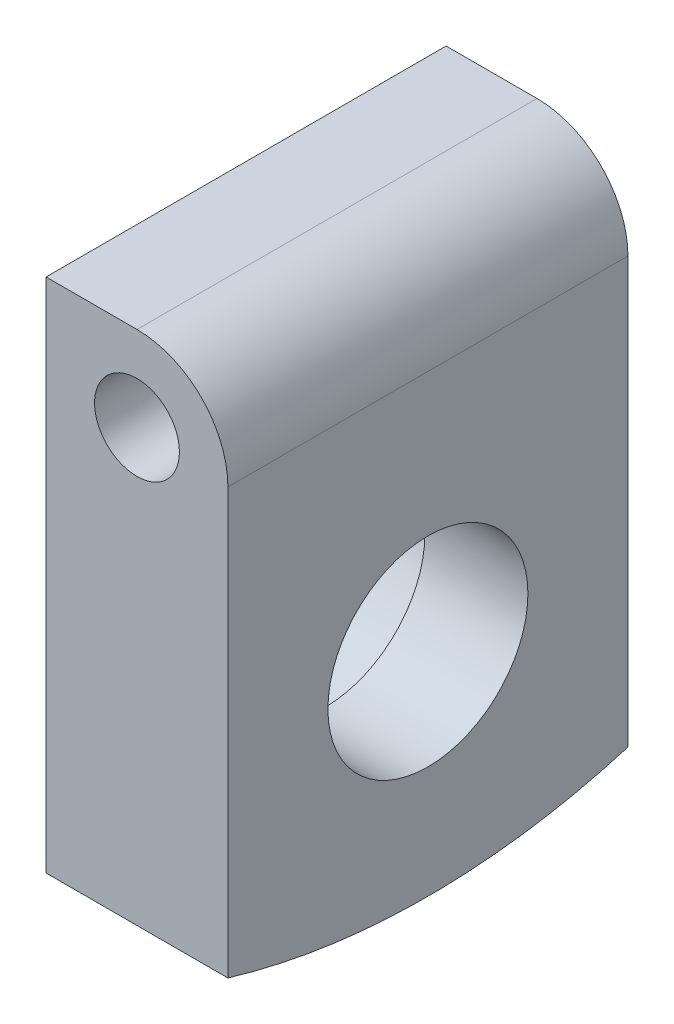
ISO-10303-21;
HEADER;
FILE_DESCRIPTION(('STEP AP214'),'2;1');
FILE_NAME('part.step','',(''),(''),'','','');
FILE_SCHEMA(('AUTOMOTIVE_DESIGN { 1 0 10303 214 1 1 1 1 }'));
ENDSEC;
DATA;
#1=APPLICATION_CONTEXT('core data for automotive mechanical design processes');
#2=APPLICATION_PROTOCOL_DEFINITION('international standard','automotive_design',2000,#1);
#3=PRODUCT_CONTEXT('',#1,'mechanical');
#4=PRODUCT('Part','Part','',(#3));
#5=PRODUCT_RELATED_PRODUCT_CATEGORY('part','',(#4));
#6=PRODUCT_DEFINITION_FORMATION('','',#4);
#7=PRODUCT_DEFINITION_CONTEXT('part definition',#1,'design');
#8=PRODUCT_DEFINITION('design','',#6,#7);
#9=PRODUCT_DEFINITION_SHAPE('','',#8);
#10=(LENGTH_UNIT() NAMED_UNIT(*) SI_UNIT(.MILLI.,.METRE.));
#11=(NAMED_UNIT(*) PLANE_ANGLE_UNIT() SI_UNIT($,.RADIAN.));
#12=(NAMED_UNIT(*) SI_UNIT($,.STERADIAN.) SOLID_ANGLE_UNIT());
#13=UNCERTAINTY_MEASURE_WITH_UNIT(LENGTH_MEASURE(1.E-05),#10,'distance_accuracy_value','');
#14=(GEOMETRIC_REPRESENTATION_CONTEXT(3) GLOBAL_UNCERTAINTY_ASSIGNED_CONTEXT((#13)) GLOBAL_UNIT_ASSIGNED_CONTEXT((#10,
#11,#12)) REPRESENTATION_CONTEXT('',''));
#15=CARTESIAN_POINT('',(0.,0.,0.));
#16=DIRECTION('',(0.,0.,1.));
#17=DIRECTION('',(1.,0.,0.));
#18=AXIS2_PLACEMENT_3D('',#15,#16,#17);
#19=CARTESIAN_POINT('',(0.,0.,66.));
#20=DIRECTION('',(1.,0.,0.));
#21=DIRECTION('',(0.,0.,-1.));
#22=AXIS2_PLACEMENT_3D('',#19,#20,#21);
#23=PLANE('',#22);
#24=CARTESIAN_POINT('',(0.,35.,33.));
#25=DIRECTION('',(1.,0.,0.));
#26=DIRECTION('',(0.,0.,-1.));
#27=AXIS2_PLACEMENT_3D('',#24,#25,#26);
#28=CIRCLE('',#27,22.5);
#29=CARTESIAN_POINT('',(0.,35.,10.5));
#30=VERTEX_POINT('',#29);
#31=EDGE_CURVE('E130',#30,#30,#28,.T.);
#32=ORIENTED_EDGE('',*,*,#31,.T.);
#33=EDGE_LOOP('',(#32));
#34=FACE_BOUND('',#33,.T.);
#35=CARTESIAN_POINT('',(0.,115.,33.));
#36=DIRECTION('',(-1.,0.,0.));
#37=DIRECTION('',(0.,0.,1.));
#38=AXIS2_PLACEMENT_3D('',#35,#36,#37);
#39=CIRCLE('',#38,115.);
#40=CARTESIAN_POINT('',(0.,4.83648516863673,0.));
#41=VERTEX_POINT('',#40);
#42=CARTESIAN_POINT('',(0.,4.83648516863673,66.));
#43=VERTEX_POINT('',#42);
#44=EDGE_CURVE('E57',#41,#43,#39,.T.);
#45=ORIENTED_EDGE('',*,*,#44,.T.);
#46=DIRECTION('',(0.,-1.,0.));
#47=VECTOR('',#46,1.);
#48=CARTESIAN_POINT('',(0.,0.,66.));
#49=LINE('',#48,#47);
#50=CARTESIAN_POINT('',(0.,90.,66.));
#51=VERTEX_POINT('',#50);
#52=EDGE_CURVE('E107',#51,#43,#49,.T.);
#53=ORIENTED_EDGE('',*,*,#52,.F.);
#54=DIRECTION('',(0.,0.,-1.));
#55=VECTOR('',#54,1.);
#56=CARTESIAN_POINT('',(0.,90.,66.));
#57=LINE('',#56,#55);
#58=CARTESIAN_POINT('',(0.,90.,0.));
#59=VERTEX_POINT('',#58);
#60=EDGE_CURVE('E124',#51,#59,#57,.T.);
#61=ORIENTED_EDGE('',*,*,#60,.T.);
#62=DIRECTION('',(0.,-1.,0.));
#63=VECTOR('',#62,1.);
#64=CARTESIAN_POINT('',(0.,0.,0.));
#65=LINE('',#64,#63);
#66=EDGE_CURVE('E125',#59,#41,#65,.T.);
#67=ORIENTED_EDGE('',*,*,#66,.T.);
#68=EDGE_LOOP('',(#45,#53,#61,#67));
#69=FACE_BOUND('',#68,.T.);
#70=ADVANCED_FACE('F42',(#34,#69),#23,.F.);
#71=CARTESIAN_POINT('',(30.,0.,66.));
#72=DIRECTION('',(-1.,0.,0.));
#73=DIRECTION('',(0.,0.,1.));
#74=AXIS2_PLACEMENT_3D('',#71,#72,#73);
#75=PLANE('',#74);
#76=CARTESIAN_POINT('',(30.,35.,33.));
#77=DIRECTION('',(1.,0.,0.));
#78=DIRECTION('',(0.,0.,-1.));
#79=AXIS2_PLACEMENT_3D('',#76,#77,#78);
#80=CIRCLE('',#79,16.5);
#81=CARTESIAN_POINT('',(30.,35.,16.5));
#82=VERTEX_POINT('',#81);
#83=EDGE_CURVE('E163',#82,#82,#80,.T.);
#84=ORIENTED_EDGE('',*,*,#83,.F.);
#85=EDGE_LOOP('',(#84));
#86=FACE_BOUND('',#85,.T.);
#87=DIRECTION('',(0.,1.,0.));
#88=VECTOR('',#87,1.);
#89=CARTESIAN_POINT('',(30.,0.,66.));
#90=LINE('',#89,#88);
#91=CARTESIAN_POINT('',(30.,4.83648516863673,66.));
#92=VERTEX_POINT('',#91);
#93=CARTESIAN_POINT('',(30.,74.9999999999999,66.));
#94=VERTEX_POINT('',#93);
#95=EDGE_CURVE('E88',#92,#94,#90,.T.);
#96=ORIENTED_EDGE('',*,*,#95,.F.);
#97=CARTESIAN_POINT('',(30.,115.,33.));
#98=DIRECTION('',(-1.,0.,0.));
#99=DIRECTION('',(0.,0.,1.));
#100=AXIS2_PLACEMENT_3D('',#97,#98,#99);
#101=CIRCLE('',#100,115.);
#102=CARTESIAN_POINT('',(30.,4.83648516863673,0.));
#103=VERTEX_POINT('',#102);
#104=EDGE_CURVE('E97',#103,#92,#101,.T.);
#105=ORIENTED_EDGE('',*,*,#104,.F.);
#106=DIRECTION('',(0.,1.,0.));
#107=VECTOR('',#106,1.);
#108=CARTESIAN_POINT('',(30.,0.,0.));
#109=LINE('',#108,#107);
#110=CARTESIAN_POINT('',(30.,74.9999999999999,0.));
#111=VERTEX_POINT('',#110);
#112=EDGE_CURVE('E129',#103,#111,#109,.T.);
#113=ORIENTED_EDGE('',*,*,#112,.T.);
#114=DIRECTION('',(0.,0.,-1.));
#115=VECTOR('',#114,1.);
#116=CARTESIAN_POINT('',(30.,74.9999999999999,66.));
#117=LINE('',#116,#115);
#118=EDGE_CURVE('E12',#94,#111,#117,.T.);
#119=ORIENTED_EDGE('',*,*,#118,.F.);
#120=EDGE_LOOP('',(#96,#105,#113,#119));
#121=FACE_BOUND('',#120,.T.);
#122=ADVANCED_FACE('F110',(#86,#121),#75,.F.);
#123=CARTESIAN_POINT('',(15.,75.,66.));
#124=DIRECTION('',(0.,0.,-1.));
#125=DIRECTION('',(-1.,0.,0.));
#126=AXIS2_PLACEMENT_3D('',#123,#124,#125);
#127=PLANE('',#126);
#128=CARTESIAN_POINT('',(15.,76.,66.));
#129=DIRECTION('',(0.,0.,1.));
#130=DIRECTION('',(1.,0.,0.));
#131=AXIS2_PLACEMENT_3D('',#128,#129,#130);
#132=CIRCLE('',#131,7.);
#133=CARTESIAN_POINT('',(8.10423471691658,77.2035037019559,66.));
#134=VERTEX_POINT('',#133);
#135=EDGE_CURVE('E155',#134,#134,#132,.T.);
#136=ORIENTED_EDGE('',*,*,#135,.F.);
#137=EDGE_LOOP('',(#136));
#138=FACE_BOUND('',#137,.T.);
#139=DIRECTION('',(-1.,0.,0.));
#140=VECTOR('',#139,1.);
#141=CARTESIAN_POINT('',(30.,4.83648516863673,66.));
#142=LINE('',#141,#140);
#143=EDGE_CURVE('E99',#92,#43,#142,.T.);
#144=ORIENTED_EDGE('',*,*,#143,.F.);
#145=ORIENTED_EDGE('',*,*,#95,.T.);
#146=CARTESIAN_POINT('',(15.,75.,66.));
#147=DIRECTION('',(0.,0.,1.));
#148=DIRECTION('',(-1.,0.,0.));
#149=AXIS2_PLACEMENT_3D('',#146,#147,#148);
#150=CIRCLE('',#149,15.);
#151=CARTESIAN_POINT('',(14.9999999999999,90.,66.));
#152=VERTEX_POINT('',#151);
#153=EDGE_CURVE('E113',#94,#152,#150,.T.);
#154=ORIENTED_EDGE('',*,*,#153,.T.);
#155=DIRECTION('',(-1.,0.,0.));
#156=VECTOR('',#155,1.);
#157=CARTESIAN_POINT('',(0.,90.,66.));
#158=LINE('',#157,#156);
#159=EDGE_CURVE('E66',#152,#51,#158,.T.);
#160=ORIENTED_EDGE('',*,*,#159,.T.);
#161=ORIENTED_EDGE('',*,*,#52,.T.);
#162=EDGE_LOOP('',(#144,#145,#154,#160,#161));
#163=FACE_BOUND('',#162,.T.);
#164=ADVANCED_FACE('F105',(#138,#163),#127,.F.);
#165=CARTESIAN_POINT('',(15.,75.,0.));
#166=DIRECTION('',(0.,0.,-1.));
#167=DIRECTION('',(-1.,0.,0.));
#168=AXIS2_PLACEMENT_3D('',#165,#166,#167);
#169=PLANE('',#168);
#170=CARTESIAN_POINT('',(15.,76.,0.));
#171=DIRECTION('',(0.,0.,-1.));
#172=DIRECTION('',(-1.,0.,0.));
#173=AXIS2_PLACEMENT_3D('',#170,#171,#172);
#174=CIRCLE('',#173,6.);
#175=CARTESIAN_POINT('',(9.12542878605688,74.7795848852498,0.));
#176=VERTEX_POINT('',#175);
#177=EDGE_CURVE('E159',#176,#176,#174,.T.);
#178=ORIENTED_EDGE('',*,*,#177,.F.);
#179=EDGE_LOOP('',(#178));
#180=FACE_BOUND('',#179,.T.);
#181=ORIENTED_EDGE('',*,*,#112,.F.);
#182=DIRECTION('',(-1.,0.,0.));
#183=VECTOR('',#182,1.);
#184=CARTESIAN_POINT('',(30.,4.83648516863673,0.));
#185=LINE('',#184,#183);
#186=EDGE_CURVE('E100',#103,#41,#185,.T.);
#187=ORIENTED_EDGE('',*,*,#186,.T.);
#188=ORIENTED_EDGE('',*,*,#66,.F.);
#189=DIRECTION('',(-1.,0.,0.));
#190=VECTOR('',#189,1.);
#191=CARTESIAN_POINT('',(0.,90.,0.));
#192=LINE('',#191,#190);
#193=CARTESIAN_POINT('',(14.9999999999999,90.,0.));
#194=VERTEX_POINT('',#193);
#195=EDGE_CURVE('E83',#194,#59,#192,.T.);
#196=ORIENTED_EDGE('',*,*,#195,.F.);
#197=CARTESIAN_POINT('',(15.,75.,0.));
#198=DIRECTION('',(0.,0.,1.));
#199=DIRECTION('',(-1.,0.,0.));
#200=AXIS2_PLACEMENT_3D('',#197,#198,#199);
#201=CIRCLE('',#200,15.);
#202=EDGE_CURVE('E133',#111,#194,#201,.T.);
#203=ORIENTED_EDGE('',*,*,#202,.F.);
#204=EDGE_LOOP('',(#181,#187,#188,#196,#203));
#205=FACE_BOUND('',#204,.T.);
#206=ADVANCED_FACE('F147',(#180,#205),#169,.T.);
#207=CARTESIAN_POINT('',(15.,75.,66.));
#208=DIRECTION('',(0.,0.,-1.));
#209=DIRECTION('',(-1.,0.,0.));
#210=AXIS2_PLACEMENT_3D('',#207,#208,#209);
#211=CYLINDRICAL_SURFACE('',#210,15.);
#212=ORIENTED_EDGE('',*,*,#202,.T.);
#213=DIRECTION('',(0.,0.,-1.));
#214=VECTOR('',#213,1.);
#215=CARTESIAN_POINT('',(14.9999999999999,90.,66.));
#216=LINE('',#215,#214);
#217=EDGE_CURVE('E50',#152,#194,#216,.T.);
#218=ORIENTED_EDGE('',*,*,#217,.F.);
#219=ORIENTED_EDGE('',*,*,#153,.F.);
#220=ORIENTED_EDGE('',*,*,#118,.T.);
#221=EDGE_LOOP('',(#212,#218,#219,#220));
#222=FACE_BOUND('',#221,.T.);
#223=ADVANCED_FACE('F210',(#222),#211,.T.);
#224=CARTESIAN_POINT('',(0.,90.,66.));
#225=DIRECTION('',(0.,-1.,0.));
#226=DIRECTION('',(0.,0.,-1.));
#227=AXIS2_PLACEMENT_3D('',#224,#225,#226);
#228=PLANE('',#227);
#229=ORIENTED_EDGE('',*,*,#195,.T.);
#230=ORIENTED_EDGE('',*,*,#60,.F.);
#231=ORIENTED_EDGE('',*,*,#159,.F.);
#232=ORIENTED_EDGE('',*,*,#217,.T.);
#233=EDGE_LOOP('',(#229,#230,#231,#232));
#234=FACE_BOUND('',#233,.T.);
#235=ADVANCED_FACE('F142',(#234),#228,.F.);
#236=CARTESIAN_POINT('',(0.,35.,33.));
#237=DIRECTION('',(1.,0.,0.));
#238=DIRECTION('',(0.,0.,-1.));
#239=AXIS2_PLACEMENT_3D('',#236,#237,#238);
#240=CYLINDRICAL_SURFACE('',#239,22.5);
#241=CARTESIAN_POINT('',(13.,35.,33.));
#242=DIRECTION('',(1.,0.,0.));
#243=DIRECTION('',(0.,0.,-1.));
#244=AXIS2_PLACEMENT_3D('',#241,#242,#243);
#245=CIRCLE('',#244,22.5);
#246=CARTESIAN_POINT('',(13.,35.,10.5));
#247=VERTEX_POINT('',#246);
#248=EDGE_CURVE('E171',#247,#247,#245,.T.);
#249=CARTESIAN_POINT('',(0.,35.,10.5));
#250=CARTESIAN_POINT('',(0.135416666666665,35.,10.5));
#251=CARTESIAN_POINT('',(0.270833333333332,35.,10.5));
#252=CARTESIAN_POINT('',(0.541666666666665,35.,10.5));
#253=CARTESIAN_POINT('',(0.677083333333332,35.,10.5));
#254=CARTESIAN_POINT('',(0.947916666666665,35.,10.5));
#255=CARTESIAN_POINT('',(1.08333333333333,35.,10.5));
#256=CARTESIAN_POINT('',(1.35416666666666,35.,10.5));
#257=CARTESIAN_POINT('',(1.48958333333333,35.,10.5));
#258=CARTESIAN_POINT('',(1.76041666666666,35.,10.5));
#259=CARTESIAN_POINT('',(1.89583333333333,35.,10.5));
#260=CARTESIAN_POINT('',(2.16666666666666,35.,10.5));
#261=CARTESIAN_POINT('',(2.30208333333333,35.,10.5));
#262=CARTESIAN_POINT('',(2.57291666666666,35.,10.5));
#263=CARTESIAN_POINT('',(2.70833333333333,35.,10.5));
#264=CARTESIAN_POINT('',(2.97916666666666,35.,10.5));
#265=CARTESIAN_POINT('',(3.11458333333333,35.,10.5));
#266=CARTESIAN_POINT('',(3.38541666666666,35.,10.5));
#267=CARTESIAN_POINT('',(3.52083333333333,35.,10.5));
#268=CARTESIAN_POINT('',(3.79166666666666,35.,10.5));
#269=CARTESIAN_POINT('',(3.92708333333333,35.,10.5));
#270=CARTESIAN_POINT('',(4.19791666666666,35.,10.5));
#271=CARTESIAN_POINT('',(4.33333333333333,35.,10.5));
#272=CARTESIAN_POINT('',(4.60416666666666,35.,10.5));
#273=CARTESIAN_POINT('',(4.73958333333333,35.,10.5));
#274=CARTESIAN_POINT('',(5.01041666666667,35.,10.5));
#275=CARTESIAN_POINT('',(5.14583333333333,35.,10.5));
#276=CARTESIAN_POINT('',(5.41666666666666,35.,10.5));
#277=CARTESIAN_POINT('',(5.55208333333333,35.,10.5));
#278=CARTESIAN_POINT('',(5.82291666666666,35.,10.5));
#279=CARTESIAN_POINT('',(5.95833333333333,35.,10.5));
#280=CARTESIAN_POINT('',(6.22916666666666,35.,10.5));
#281=CARTESIAN_POINT('',(6.36458333333333,35.,10.5));
#282=CARTESIAN_POINT('',(6.63541666666666,35.,10.5));
#283=CARTESIAN_POINT('',(6.77083333333333,35.,10.5));
#284=CARTESIAN_POINT('',(7.04166666666667,35.,10.5));
#285=CARTESIAN_POINT('',(7.17708333333333,35.,10.5));
#286=CARTESIAN_POINT('',(7.44791666666666,35.,10.5));
#287=CARTESIAN_POINT('',(7.58333333333333,35.,10.5));
#288=CARTESIAN_POINT('',(7.85416666666666,35.,10.5));
#289=CARTESIAN_POINT('',(7.98958333333333,35.,10.5));
#290=CARTESIAN_POINT('',(8.26041666666666,35.,10.5));
#291=CARTESIAN_POINT('',(8.39583333333333,35.,10.5));
#292=CARTESIAN_POINT('',(8.66666666666666,35.,10.5));
#293=CARTESIAN_POINT('',(8.80208333333333,35.,10.5));
#294=CARTESIAN_POINT('',(9.07291666666666,35.,10.5));
#295=CARTESIAN_POINT('',(9.20833333333333,35.,10.5));
#296=CARTESIAN_POINT('',(9.47916666666667,35.,10.5));
#297=CARTESIAN_POINT('',(9.61458333333333,35.,10.5));
#298=CARTESIAN_POINT('',(9.88541666666666,35.,10.5));
#299=CARTESIAN_POINT('',(10.0208333333333,35.,10.5));
#300=CARTESIAN_POINT('',(10.2916666666667,35.,10.5));
#301=CARTESIAN_POINT('',(10.4270833333333,35.,10.5));
#302=CARTESIAN_POINT('',(10.6979166666667,35.,10.5));
#303=CARTESIAN_POINT('',(10.8333333333333,35.,10.5));
#304=CARTESIAN_POINT('',(11.1041666666667,35.,10.5));
#305=CARTESIAN_POINT('',(11.2395833333333,35.,10.5));
#306=CARTESIAN_POINT('',(11.5104166666667,35.,10.5));
#307=CARTESIAN_POINT('',(11.6458333333333,35.,10.5));
#308=CARTESIAN_POINT('',(11.9166666666667,35.,10.5));
#309=CARTESIAN_POINT('',(12.0520833333333,35.,10.5));
#310=CARTESIAN_POINT('',(12.3229166666667,35.,10.5));
#311=CARTESIAN_POINT('',(12.4583333333333,35.,10.5));
#312=CARTESIAN_POINT('',(12.7291666666667,35.,10.5));
#313=CARTESIAN_POINT('',(12.8645833333333,35.,10.5));
#314=CARTESIAN_POINT('',(13.,35.,10.5));
#315=B_SPLINE_CURVE_WITH_KNOTS('',3,(#249,#250,#251,#252,#253,#254,#255,#256,#257,#258,#259,
#260,#261,#262,#263,#264,#265,#266,#267,#268,#269,#270,#271,#272,#273,#274,#275,#276,#277,#278,
#279,#280,#281,#282,#283,#284,#285,#286,#287,#288,#289,#290,#291,#292,#293,#294,#295,#296,#297,
#298,#299,#300,#301,#302,#303,#304,#305,#306,#307,#308,#309,#310,#311,#312,#313,#314),
.UNSPECIFIED.,.F.,.F.,(4,2,2,2,2,2,2,2,2,2,2,2,2,2,2,2,2,2,2,2,2,2,2,2,2,2,2,2,2,2,2,2,4),(0.,
0.40625,0.8125,1.21875,1.625,2.03125,2.4375,2.84375,3.25,3.65625,4.0625,4.46875,4.875,5.28125,
5.6875,6.09375,6.5,6.90625,7.3125,7.71875,8.125,8.53125,8.9375,9.34375,9.75,10.15625,10.5625,
10.96875,11.375,11.78125,12.1875,12.59375,13.),.UNSPECIFIED.);
#316=EDGE_CURVE('BSEAM179',#30,#247,#315,.T.);
#317=ORIENTED_EDGE('',*,*,#31,.F.);
#318=ORIENTED_EDGE('',*,*,#248,.T.);
#319=ORIENTED_EDGE('',*,*,#316,.T.);
#320=ORIENTED_EDGE('',*,*,#316,.F.);
#321=EDGE_LOOP('',(#317,#319,#318,#320));
#322=FACE_BOUND('',#321,.T.);
#323=ADVANCED_FACE('F179',(#322),#240,.F.);
#324=CARTESIAN_POINT('',(13.,35.,33.));
#325=DIRECTION('',(1.,0.,0.));
#326=DIRECTION('',(0.,0.,-1.));
#327=AXIS2_PLACEMENT_3D('',#324,#325,#326);
#328=PLANE('',#327);
#329=CARTESIAN_POINT('',(13.,35.,33.));
#330=DIRECTION('',(1.,0.,0.));
#331=DIRECTION('',(0.,0.,-1.));
#332=AXIS2_PLACEMENT_3D('',#329,#330,#331);
#333=CIRCLE('',#332,16.5);
#334=CARTESIAN_POINT('',(13.,35.,16.5));
#335=VERTEX_POINT('',#334);
#336=EDGE_CURVE('E167',#335,#335,#333,.F.);
#337=ORIENTED_EDGE('',*,*,#336,.F.);
#338=EDGE_LOOP('',(#337));
#339=FACE_BOUND('',#338,.T.);
#340=ORIENTED_EDGE('',*,*,#248,.F.);
#341=EDGE_LOOP('',(#340));
#342=FACE_BOUND('',#341,.T.);
#343=ADVANCED_FACE('F181',(#339,#342),#328,.F.);
#344=CARTESIAN_POINT('',(-0.001000000000001,35.,33.));
#345=DIRECTION('',(1.,0.,0.));
#346=DIRECTION('',(0.,0.,-1.));
#347=AXIS2_PLACEMENT_3D('',#344,#345,#346);
#348=CYLINDRICAL_SURFACE('',#347,16.5);
#349=ORIENTED_EDGE('',*,*,#83,.T.);
#350=EDGE_LOOP('',(#349));
#351=FACE_BOUND('',#350,.T.);
#352=ORIENTED_EDGE('',*,*,#336,.T.);
#353=EDGE_LOOP('',(#352));
#354=FACE_BOUND('',#353,.T.);
#355=ADVANCED_FACE('F183',(#351,#354),#348,.F.);
#356=CARTESIAN_POINT('',(8.10423471691658,77.2035037019559,66.));
#357=CARTESIAN_POINT('',(9.12542878605688,74.7795848852498,0.));
#358=CARTESIAN_POINT('',(10.5112421208283,90.9950342681227,66.));
#359=CARTESIAN_POINT('',(6.6845985565564,86.528727313136,0.));
#360=CARTESIAN_POINT('',(24.3027726869952,88.588026864211,66.));
#361=CARTESIAN_POINT('',(18.4337409844426,88.9695575426365,0.));
#362=CARTESIAN_POINT('',(21.8957652830834,74.7964962980441,66.));
#363=CARTESIAN_POINT('',(20.8745712139431,77.2204151147502,0.));
#364=CARTESIAN_POINT('',(19.4887578791717,61.0049657318773,66.));
#365=CARTESIAN_POINT('',(23.3154014434436,65.471272686864,0.));
#366=CARTESIAN_POINT('',(5.69722731300485,63.411973135789,66.));
#367=CARTESIAN_POINT('',(11.5662590155574,63.0304424573635,0.));
#368=CARTESIAN_POINT('',(8.10423471691658,77.2035037019559,66.));
#369=CARTESIAN_POINT('',(9.12542878605688,74.7795848852498,0.));
#370=(BOUNDED_SURFACE() B_SPLINE_SURFACE(3,1,((#356,#357),(#358,#359),(#360,#361),(#362,#363),
(#364,#365),(#366,#367),(#368,#369)),.UNSPECIFIED.,.T.,.F.,.F.) B_SPLINE_SURFACE_WITH_KNOTS((4,
3,4),(2,2),(0.,0.5,1.),(0.,1.),
.UNSPECIFIED.) GEOMETRIC_REPRESENTATION_ITEM() RATIONAL_B_SPLINE_SURFACE(((1.,1.),
(0.333333333333333,0.333333333333333),(0.333333333333333,0.333333333333333),(1.,1.),
(0.333333333333334,0.333333333333333),(0.333333333333334,0.333333333333333),(1.,1.))) REPRESENTATION_ITEM('') SURFACE());
#371=CARTESIAN_POINT('',(8.10423471691658,77.2035037019559,66.));
#372=CARTESIAN_POINT('',(8.11487215513679,77.1782545476152,65.3125));
#373=CARTESIAN_POINT('',(8.125509593357,77.1530053932745,64.625));
#374=CARTESIAN_POINT('',(8.14678446979743,77.1025070845931,63.25));
#375=CARTESIAN_POINT('',(8.15742190801764,77.0772579302524,62.5625));
#376=CARTESIAN_POINT('',(8.17869678445806,77.026759621571,61.1875));
#377=CARTESIAN_POINT('',(8.18933422267827,77.0015104672303,60.5));
#378=CARTESIAN_POINT('',(8.21060909911869,76.951012158549,59.125));
#379=CARTESIAN_POINT('',(8.22124653733891,76.9257630042083,58.4375));
#380=CARTESIAN_POINT('',(8.24252141377933,76.8752646955269,57.0625));
#381=CARTESIAN_POINT('',(8.25315885199954,76.8500155411862,56.375));
#382=CARTESIAN_POINT('',(8.27443372843996,76.7995172325048,55.));
#383=CARTESIAN_POINT('',(8.28507116666018,76.7742680781642,54.3125));
#384=CARTESIAN_POINT('',(8.3063460431006,76.7237697694828,52.9375));
#385=CARTESIAN_POINT('',(8.31698348132081,76.6985206151421,52.25));
#386=CARTESIAN_POINT('',(8.33825835776123,76.6480223064607,50.875));
#387=CARTESIAN_POINT('',(8.34889579598144,76.62277315212,50.1875));
#388=CARTESIAN_POINT('',(8.37017067242186,76.5722748434386,48.8125));
#389=CARTESIAN_POINT('',(8.38080811064208,76.5470256890979,48.125));
#390=CARTESIAN_POINT('',(8.4020829870825,76.4965273804166,46.75));
#391=CARTESIAN_POINT('',(8.41272042530271,76.4712782260759,46.0625));
#392=CARTESIAN_POINT('',(8.43399530174313,76.4207799173945,44.6875));
#393=CARTESIAN_POINT('',(8.44463273996335,76.3955307630538,44.));
#394=CARTESIAN_POINT('',(8.46590761640377,76.3450324543725,42.625));
#395=CARTESIAN_POINT('',(8.47654505462398,76.3197833000318,41.9375));
#396=CARTESIAN_POINT('',(8.4978199310644,76.2692849913504,40.5625));
#397=CARTESIAN_POINT('',(8.50845736928461,76.2440358370097,39.875));
#398=CARTESIAN_POINT('',(8.52973224572504,76.1935375283283,38.5));
#399=CARTESIAN_POINT('',(8.54036968394525,76.1682883739876,37.8125));
#400=CARTESIAN_POINT('',(8.56164456038567,76.1177900653063,36.4375));
#401=CARTESIAN_POINT('',(8.57228199860588,76.0925409109656,35.75));
#402=CARTESIAN_POINT('',(8.59355687504631,76.0420426022842,34.375));
#403=CARTESIAN_POINT('',(8.60419431326652,76.0167934479435,33.6875));
#404=CARTESIAN_POINT('',(8.62546918970694,75.9662951392621,32.3125));
#405=CARTESIAN_POINT('',(8.63610662792715,75.9410459849214,31.625));
#406=CARTESIAN_POINT('',(8.65738150436757,75.8905476762401,30.25));
#407=CARTESIAN_POINT('',(8.66801894258779,75.8652985218993,29.5625));
#408=CARTESIAN_POINT('',(8.68929381902821,75.814800213218,28.1875));
#409=CARTESIAN_POINT('',(8.69993125724842,75.7895510588773,27.5));
#410=CARTESIAN_POINT('',(8.72120613368884,75.7390527501959,26.125));
#411=CARTESIAN_POINT('',(8.73184357190905,75.7138035958552,25.4375));
#412=CARTESIAN_POINT('',(8.75311844834948,75.6633052871739,24.0625));
#413=CARTESIAN_POINT('',(8.76375588656969,75.6380561328332,23.375));
#414=CARTESIAN_POINT('',(8.78503076301011,75.5875578241518,22.));
#415=CARTESIAN_POINT('',(8.79566820123032,75.5623086698111,21.3125));
#416=CARTESIAN_POINT('',(8.81694307767074,75.5118103611297,19.9375));
#417=CARTESIAN_POINT('',(8.82758051589096,75.486561206789,19.25));
#418=CARTESIAN_POINT('',(8.84885539233138,75.4360628981077,17.875));
#419=CARTESIAN_POINT('',(8.85949283055159,75.410813743767,17.1875));
#420=CARTESIAN_POINT('',(8.88076770699201,75.3603154350856,15.8125));
#421=CARTESIAN_POINT('',(8.89140514521223,75.3350662807449,15.125));
#422=CARTESIAN_POINT('',(8.91268002165265,75.2845679720635,13.75));
#423=CARTESIAN_POINT('',(8.92331745987286,75.2593188177228,13.0625));
#424=CARTESIAN_POINT('',(8.94459233631328,75.2088205090415,11.6875));
#425=CARTESIAN_POINT('',(8.95522977453349,75.1835713547008,11.));
#426=CARTESIAN_POINT('',(8.97650465097392,75.1330730460194,9.625));
#427=CARTESIAN_POINT('',(8.98714208919413,75.1078238916787,8.9375));
#428=CARTESIAN_POINT('',(9.00841696563455,75.0573255829973,7.5625));
#429=CARTESIAN_POINT('',(9.01905440385476,75.0320764286566,6.875));
#430=CARTESIAN_POINT('',(9.04032928029519,74.9815781199753,5.5));
#431=CARTESIAN_POINT('',(9.0509667185154,74.9563289656346,4.8125));
#432=CARTESIAN_POINT('',(9.07224159495582,74.9058306569532,3.4375));
#433=CARTESIAN_POINT('',(9.08287903317603,74.8805815026125,2.75));
#434=CARTESIAN_POINT('',(9.10415390961645,74.8300831939311,1.375));
#435=CARTESIAN_POINT('',(9.11479134783667,74.8048340395904,0.6875));
#436=CARTESIAN_POINT('',(9.12542878605688,74.7795848852498,0.));
#437=B_SPLINE_CURVE_WITH_KNOTS('',3,(#371,#372,#373,#374,#375,#376,#377,#378,#379,#380,#381,
#382,#383,#384,#385,#386,#387,#388,#389,#390,#391,#392,#393,#394,#395,#396,#397,#398,#399,#400,
#401,#402,#403,#404,#405,#406,#407,#408,#409,#410,#411,#412,#413,#414,#415,#416,#417,#418,#419,
#420,#421,#422,#423,#424,#425,#426,#427,#428,#429,#430,#431,#432,#433,#434,#435,#436),
.UNSPECIFIED.,.F.,.F.,(4,2,2,2,2,2,2,2,2,2,2,2,2,2,2,2,2,2,2,2,2,2,2,2,2,2,2,2,2,2,2,2,4),(0.,
2.0641371863278,4.12827437265562,6.19241155898342,8.25654874531123,10.320685931639,
12.3848231179668,14.4489603042947,16.5130974906225,18.5772346769503,20.6413718632781,
22.7055090496059,24.7696462359337,26.8337834222615,28.8979206085893,30.9620577949171,
33.0261949812449,35.0903321675727,37.1544693539005,39.2186065402283,41.2827437265562,
43.346880912884,45.4110180992118,47.4751552855396,49.5392924718674,51.6034296581952,
53.667566844523,55.7317040308508,57.7958412171786,59.8599784035064,61.9241155898342,
63.988252776162,66.0523899624898),.UNSPECIFIED.);
#438=EDGE_CURVE('BSEAM190',#134,#176,#437,.T.);
#439=ORIENTED_EDGE('',*,*,#135,.T.);
#440=ORIENTED_EDGE('',*,*,#177,.T.);
#441=ORIENTED_EDGE('',*,*,#438,.T.);
#442=ORIENTED_EDGE('',*,*,#438,.F.);
#443=EDGE_LOOP('',(#439,#441,#440,#442));
#444=FACE_BOUND('',#443,.T.);
#445=ADVANCED_FACE('F190',(#444),#370,.F.);
#446=CARTESIAN_POINT('',(30.,115.,33.));
#447=DIRECTION('',(-1.,0.,0.));
#448=DIRECTION('',(0.,0.,1.));
#449=AXIS2_PLACEMENT_3D('',#446,#447,#448);
#450=CYLINDRICAL_SURFACE('',#449,115.);
#451=ORIENTED_EDGE('',*,*,#44,.F.);
#452=ORIENTED_EDGE('',*,*,#186,.F.);
#453=ORIENTED_EDGE('',*,*,#104,.T.);
#454=ORIENTED_EDGE('',*,*,#143,.T.);
#455=EDGE_LOOP('',(#451,#452,#453,#454));
#456=FACE_BOUND('',#455,.T.);
#457=ADVANCED_FACE('F98',(#456),#450,.T.);
#458=CLOSED_SHELL('',(#70,#122,#164,#206,#223,#235,#323,#343,#355,#445,#457));
#459=MANIFOLD_SOLID_BREP('B2',#458);
#460=ADVANCED_BREP_SHAPE_REPRESENTATION('',(#18,#459),#14);
#461=SHAPE_DEFINITION_REPRESENTATION(#9,#460);
ENDSEC;
END-ISO-10303-21;
